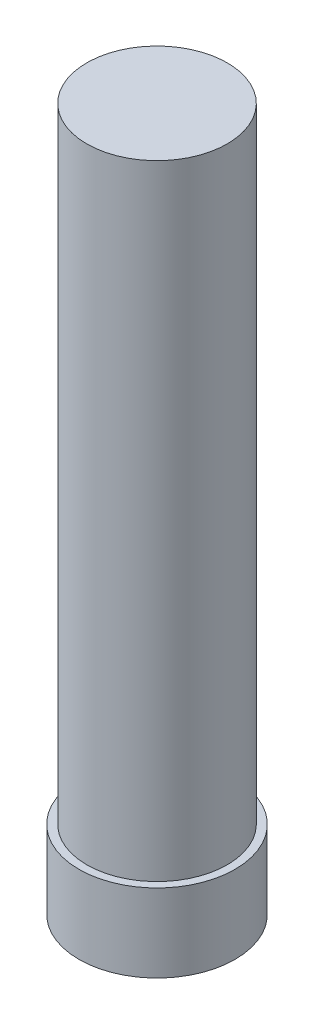
ISO-10303-21;
HEADER;
FILE_DESCRIPTION(('STEP AP214'),'2;1');
FILE_NAME('part.step','',(''),(''),'','','');
FILE_SCHEMA(('AUTOMOTIVE_DESIGN { 1 0 10303 214 1 1 1 1 }'));
ENDSEC;
DATA;
#1=APPLICATION_CONTEXT('core data for automotive mechanical design processes');
#2=APPLICATION_PROTOCOL_DEFINITION('international standard','automotive_design',2000,#1);
#3=PRODUCT_CONTEXT('',#1,'mechanical');
#4=PRODUCT('Part','Part','',(#3));
#5=PRODUCT_RELATED_PRODUCT_CATEGORY('part','',(#4));
#6=PRODUCT_DEFINITION_FORMATION('','',#4);
#7=PRODUCT_DEFINITION_CONTEXT('part definition',#1,'design');
#8=PRODUCT_DEFINITION('design','',#6,#7);
#9=PRODUCT_DEFINITION_SHAPE('','',#8);
#10=(LENGTH_UNIT() NAMED_UNIT(*) SI_UNIT(.MILLI.,.METRE.));
#11=(NAMED_UNIT(*) PLANE_ANGLE_UNIT() SI_UNIT($,.RADIAN.));
#12=(NAMED_UNIT(*) SI_UNIT($,.STERADIAN.) SOLID_ANGLE_UNIT());
#13=UNCERTAINTY_MEASURE_WITH_UNIT(LENGTH_MEASURE(1.E-05),#10,'distance_accuracy_value','');
#14=(GEOMETRIC_REPRESENTATION_CONTEXT(3) GLOBAL_UNCERTAINTY_ASSIGNED_CONTEXT((#13)) GLOBAL_UNIT_ASSIGNED_CONTEXT((#10,
#11,#12)) REPRESENTATION_CONTEXT('',''));
#15=CARTESIAN_POINT('',(0.,0.,0.));
#16=DIRECTION('',(0.,0.,1.));
#17=DIRECTION('',(1.,0.,0.));
#18=AXIS2_PLACEMENT_3D('',#15,#16,#17);
#19=CARTESIAN_POINT('',(0.,101.6,0.));
#20=DIRECTION('',(0.,-1.,0.));
#21=DIRECTION('',(0.,0.,-1.));
#22=AXIS2_PLACEMENT_3D('',#19,#20,#21);
#23=CYLINDRICAL_SURFACE('',#22,11.43);
#24=CARTESIAN_POINT('',(0.,101.6,0.));
#25=DIRECTION('',(0.,1.,0.));
#26=DIRECTION('',(0.,0.,1.));
#27=AXIS2_PLACEMENT_3D('',#24,#25,#26);
#28=CIRCLE('',#27,11.43);
#29=CARTESIAN_POINT('',(0.,101.6,11.43));
#30=VERTEX_POINT('',#29);
#31=EDGE_CURVE('E10',#30,#30,#28,.T.);
#32=ORIENTED_EDGE('',*,*,#31,.F.);
#33=EDGE_LOOP('',(#32));
#34=FACE_BOUND('',#33,.T.);
#35=CARTESIAN_POINT('',(0.,0.,0.));
#36=DIRECTION('',(0.,1.,0.));
#37=DIRECTION('',(0.,0.,1.));
#38=AXIS2_PLACEMENT_3D('',#35,#36,#37);
#39=CIRCLE('',#38,11.43);
#40=CARTESIAN_POINT('',(0.,0.,11.43));
#41=VERTEX_POINT('',#40);
#42=EDGE_CURVE('E40',#41,#41,#39,.T.);
#43=ORIENTED_EDGE('',*,*,#42,.T.);
#44=EDGE_LOOP('',(#43));
#45=FACE_BOUND('',#44,.T.);
#46=ADVANCED_FACE('F37',(#34,#45),#23,.T.);
#47=CARTESIAN_POINT('',(0.,101.6,0.));
#48=DIRECTION('',(0.,1.,0.));
#49=DIRECTION('',(0.,0.,1.));
#50=AXIS2_PLACEMENT_3D('',#47,#48,#49);
#51=PLANE('',#50);
#52=ORIENTED_EDGE('',*,*,#31,.T.);
#53=EDGE_LOOP('',(#52));
#54=FACE_BOUND('',#53,.T.);
#55=ADVANCED_FACE('F72',(#54),#51,.T.);
#56=CARTESIAN_POINT('',(0.,-12.7,0.));
#57=DIRECTION('',(0.,1.,0.));
#58=DIRECTION('',(0.,0.,1.));
#59=AXIS2_PLACEMENT_3D('',#56,#57,#58);
#60=CYLINDRICAL_SURFACE('',#59,12.7);
#61=CARTESIAN_POINT('',(0.,-12.7,0.));
#62=DIRECTION('',(0.,1.,0.));
#63=DIRECTION('',(0.,0.,1.));
#64=AXIS2_PLACEMENT_3D('',#61,#62,#63);
#65=CIRCLE('',#64,12.7);
#66=CARTESIAN_POINT('',(0.,-12.7,12.7));
#67=VERTEX_POINT('',#66);
#68=EDGE_CURVE('E49',#67,#67,#65,.T.);
#69=ORIENTED_EDGE('',*,*,#68,.T.);
#70=EDGE_LOOP('',(#69));
#71=FACE_BOUND('',#70,.T.);
#72=CARTESIAN_POINT('',(0.,0.,0.));
#73=DIRECTION('',(0.,1.,0.));
#74=DIRECTION('',(0.,0.,1.));
#75=AXIS2_PLACEMENT_3D('',#72,#73,#74);
#76=CIRCLE('',#75,12.7);
#77=CARTESIAN_POINT('',(0.,0.,12.7));
#78=VERTEX_POINT('',#77);
#79=EDGE_CURVE('E51',#78,#78,#76,.T.);
#80=ORIENTED_EDGE('',*,*,#79,.F.);
#81=EDGE_LOOP('',(#80));
#82=FACE_BOUND('',#81,.T.);
#83=ADVANCED_FACE('F59',(#71,#82),#60,.T.);
#84=CARTESIAN_POINT('',(0.,-12.7,0.));
#85=DIRECTION('',(0.,1.,0.));
#86=DIRECTION('',(0.,0.,1.));
#87=AXIS2_PLACEMENT_3D('',#84,#85,#86);
#88=PLANE('',#87);
#89=ORIENTED_EDGE('',*,*,#68,.F.);
#90=EDGE_LOOP('',(#89));
#91=FACE_BOUND('',#90,.T.);
#92=ADVANCED_FACE('F62',(#91),#88,.F.);
#93=CARTESIAN_POINT('',(0.,0.,0.));
#94=DIRECTION('',(0.,1.,0.));
#95=DIRECTION('',(0.,0.,1.));
#96=AXIS2_PLACEMENT_3D('',#93,#94,#95);
#97=PLANE('',#96);
#98=ORIENTED_EDGE('',*,*,#42,.F.);
#99=EDGE_LOOP('',(#98));
#100=FACE_BOUND('',#99,.T.);
#101=ORIENTED_EDGE('',*,*,#79,.T.);
#102=EDGE_LOOP('',(#101));
#103=FACE_BOUND('',#102,.T.);
#104=ADVANCED_FACE('F64',(#100,#103),#97,.T.);
#105=CLOSED_SHELL('',(#46,#55,#83,#92,#104));
#106=MANIFOLD_SOLID_BREP('B2',#105);
#107=ADVANCED_BREP_SHAPE_REPRESENTATION('',(#18,#106),#14);
#108=SHAPE_DEFINITION_REPRESENTATION(#9,#107);
ENDSEC;
END-ISO-10303-21;
